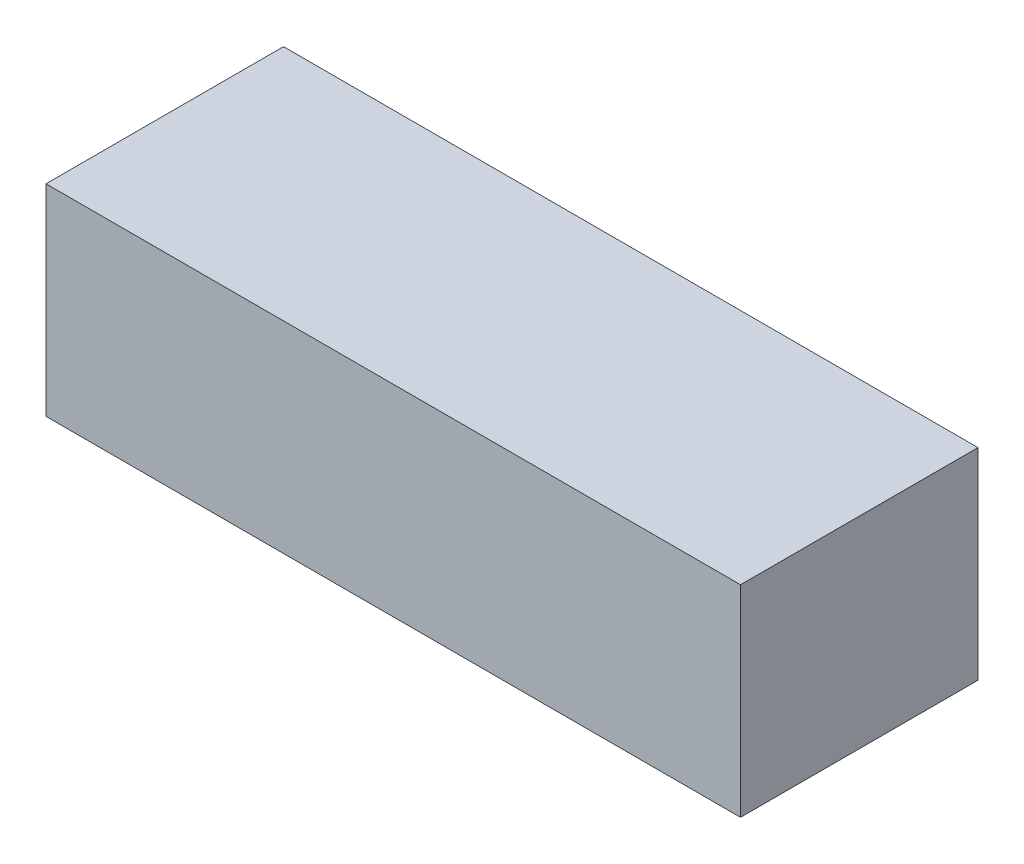
ISO-10303-21;
HEADER;
FILE_DESCRIPTION(('STEP AP214'),'2;1');
FILE_NAME('part.step','',(''),(''),'','','');
FILE_SCHEMA(('AUTOMOTIVE_DESIGN { 1 0 10303 214 1 1 1 1 }'));
ENDSEC;
DATA;
#1=APPLICATION_CONTEXT('core data for automotive mechanical design processes');
#2=APPLICATION_PROTOCOL_DEFINITION('international standard','automotive_design',2000,#1);
#3=PRODUCT_CONTEXT('',#1,'mechanical');
#4=PRODUCT('Part','Part','',(#3));
#5=PRODUCT_RELATED_PRODUCT_CATEGORY('part','',(#4));
#6=PRODUCT_DEFINITION_FORMATION('','',#4);
#7=PRODUCT_DEFINITION_CONTEXT('part definition',#1,'design');
#8=PRODUCT_DEFINITION('design','',#6,#7);
#9=PRODUCT_DEFINITION_SHAPE('','',#8);
#10=(LENGTH_UNIT() NAMED_UNIT(*) SI_UNIT(.MILLI.,.METRE.));
#11=(NAMED_UNIT(*) PLANE_ANGLE_UNIT() SI_UNIT($,.RADIAN.));
#12=(NAMED_UNIT(*) SI_UNIT($,.STERADIAN.) SOLID_ANGLE_UNIT());
#13=UNCERTAINTY_MEASURE_WITH_UNIT(LENGTH_MEASURE(1.E-05),#10,'distance_accuracy_value','');
#14=(GEOMETRIC_REPRESENTATION_CONTEXT(3) GLOBAL_UNCERTAINTY_ASSIGNED_CONTEXT((#13)) GLOBAL_UNIT_ASSIGNED_CONTEXT((#10,
#11,#12)) REPRESENTATION_CONTEXT('',''));
#15=CARTESIAN_POINT('',(0.,0.,0.));
#16=DIRECTION('',(0.,0.,1.));
#17=DIRECTION('',(1.,0.,0.));
#18=AXIS2_PLACEMENT_3D('',#15,#16,#17);
#19=CARTESIAN_POINT('',(32.75,19.,-11.2));
#20=DIRECTION('',(-1.,0.,0.));
#21=DIRECTION('',(0.,0.,1.));
#22=AXIS2_PLACEMENT_3D('',#19,#20,#21);
#23=PLANE('',#22);
#24=DIRECTION('',(0.,0.,-1.));
#25=VECTOR('',#24,1.);
#26=CARTESIAN_POINT('',(32.75,0.,-11.2));
#27=LINE('',#26,#25);
#28=CARTESIAN_POINT('',(32.75,0.,11.2));
#29=VERTEX_POINT('',#28);
#30=CARTESIAN_POINT('',(32.75,0.,-11.2));
#31=VERTEX_POINT('',#30);
#32=EDGE_CURVE('E98',#29,#31,#27,.T.);
#33=ORIENTED_EDGE('',*,*,#32,.T.);
#34=DIRECTION('',(0.,-1.,0.));
#35=VECTOR('',#34,1.);
#36=CARTESIAN_POINT('',(32.75,19.,-11.2));
#37=LINE('',#36,#35);
#38=CARTESIAN_POINT('',(32.75,19.,-11.2));
#39=VERTEX_POINT('',#38);
#40=EDGE_CURVE('E11',#39,#31,#37,.T.);
#41=ORIENTED_EDGE('',*,*,#40,.F.);
#42=DIRECTION('',(0.,0.,-1.));
#43=VECTOR('',#42,1.);
#44=CARTESIAN_POINT('',(32.75,19.,-11.2));
#45=LINE('',#44,#43);
#46=CARTESIAN_POINT('',(32.75,19.,11.2));
#47=VERTEX_POINT('',#46);
#48=EDGE_CURVE('E86',#47,#39,#45,.T.);
#49=ORIENTED_EDGE('',*,*,#48,.F.);
#50=DIRECTION('',(0.,-1.,0.));
#51=VECTOR('',#50,1.);
#52=CARTESIAN_POINT('',(32.75,19.,11.2));
#53=LINE('',#52,#51);
#54=EDGE_CURVE('E94',#47,#29,#53,.T.);
#55=ORIENTED_EDGE('',*,*,#54,.T.);
#56=EDGE_LOOP('',(#33,#41,#49,#55));
#57=FACE_BOUND('',#56,.T.);
#58=ADVANCED_FACE('F35',(#57),#23,.F.);
#59=CARTESIAN_POINT('',(-32.75,19.,-11.2));
#60=DIRECTION('',(0.,0.,1.));
#61=DIRECTION('',(1.,0.,0.));
#62=AXIS2_PLACEMENT_3D('',#59,#60,#61);
#63=PLANE('',#62);
#64=DIRECTION('',(-1.,0.,0.));
#65=VECTOR('',#64,1.);
#66=CARTESIAN_POINT('',(-32.75,0.,-11.2));
#67=LINE('',#66,#65);
#68=CARTESIAN_POINT('',(-32.75,0.,-11.2));
#69=VERTEX_POINT('',#68);
#70=EDGE_CURVE('E90',#31,#69,#67,.T.);
#71=ORIENTED_EDGE('',*,*,#70,.T.);
#72=DIRECTION('',(0.,-1.,0.));
#73=VECTOR('',#72,1.);
#74=CARTESIAN_POINT('',(-32.75,19.,-11.2));
#75=LINE('',#74,#73);
#76=CARTESIAN_POINT('',(-32.75,19.,-11.2));
#77=VERTEX_POINT('',#76);
#78=EDGE_CURVE('E43',#77,#69,#75,.T.);
#79=ORIENTED_EDGE('',*,*,#78,.F.);
#80=DIRECTION('',(-1.,0.,0.));
#81=VECTOR('',#80,1.);
#82=CARTESIAN_POINT('',(-32.75,19.,-11.2));
#83=LINE('',#82,#81);
#84=EDGE_CURVE('E81',#39,#77,#83,.T.);
#85=ORIENTED_EDGE('',*,*,#84,.F.);
#86=ORIENTED_EDGE('',*,*,#40,.T.);
#87=EDGE_LOOP('',(#71,#79,#85,#86));
#88=FACE_BOUND('',#87,.T.);
#89=ADVANCED_FACE('F89',(#88),#63,.F.);
#90=CARTESIAN_POINT('',(-32.75,19.,-11.2));
#91=DIRECTION('',(1.,0.,0.));
#92=DIRECTION('',(0.,0.,-1.));
#93=AXIS2_PLACEMENT_3D('',#90,#91,#92);
#94=PLANE('',#93);
#95=DIRECTION('',(0.,0.,1.));
#96=VECTOR('',#95,1.);
#97=CARTESIAN_POINT('',(-32.75,0.,-11.2));
#98=LINE('',#97,#96);
#99=CARTESIAN_POINT('',(-32.75,0.,11.2));
#100=VERTEX_POINT('',#99);
#101=EDGE_CURVE('E68',#69,#100,#98,.T.);
#102=ORIENTED_EDGE('',*,*,#101,.T.);
#103=DIRECTION('',(0.,-1.,0.));
#104=VECTOR('',#103,1.);
#105=CARTESIAN_POINT('',(-32.75,19.,11.2));
#106=LINE('',#105,#104);
#107=CARTESIAN_POINT('',(-32.75,19.,11.2));
#108=VERTEX_POINT('',#107);
#109=EDGE_CURVE('E91',#108,#100,#106,.T.);
#110=ORIENTED_EDGE('',*,*,#109,.F.);
#111=DIRECTION('',(0.,0.,1.));
#112=VECTOR('',#111,1.);
#113=CARTESIAN_POINT('',(-32.75,19.,-11.2));
#114=LINE('',#113,#112);
#115=EDGE_CURVE('E84',#77,#108,#114,.T.);
#116=ORIENTED_EDGE('',*,*,#115,.F.);
#117=ORIENTED_EDGE('',*,*,#78,.T.);
#118=EDGE_LOOP('',(#102,#110,#116,#117));
#119=FACE_BOUND('',#118,.T.);
#120=ADVANCED_FACE('F92',(#119),#94,.F.);
#121=CARTESIAN_POINT('',(-32.75,19.,11.2));
#122=DIRECTION('',(0.,0.,-1.));
#123=DIRECTION('',(-1.,0.,0.));
#124=AXIS2_PLACEMENT_3D('',#121,#122,#123);
#125=PLANE('',#124);
#126=DIRECTION('',(1.,0.,0.));
#127=VECTOR('',#126,1.);
#128=CARTESIAN_POINT('',(-32.75,0.,11.2));
#129=LINE('',#128,#127);
#130=EDGE_CURVE('E74',#100,#29,#129,.T.);
#131=ORIENTED_EDGE('',*,*,#130,.T.);
#132=ORIENTED_EDGE('',*,*,#54,.F.);
#133=DIRECTION('',(1.,0.,0.));
#134=VECTOR('',#133,1.);
#135=CARTESIAN_POINT('',(-32.75,19.,11.2));
#136=LINE('',#135,#134);
#137=EDGE_CURVE('E51',#108,#47,#136,.T.);
#138=ORIENTED_EDGE('',*,*,#137,.F.);
#139=ORIENTED_EDGE('',*,*,#109,.T.);
#140=EDGE_LOOP('',(#131,#132,#138,#139));
#141=FACE_BOUND('',#140,.T.);
#142=ADVANCED_FACE('F105',(#141),#125,.F.);
#143=CARTESIAN_POINT('',(0.,19.,0.));
#144=DIRECTION('',(0.,1.,0.));
#145=DIRECTION('',(0.,0.,1.));
#146=AXIS2_PLACEMENT_3D('',#143,#144,#145);
#147=PLANE('',#146);
#148=ORIENTED_EDGE('',*,*,#48,.T.);
#149=ORIENTED_EDGE('',*,*,#84,.T.);
#150=ORIENTED_EDGE('',*,*,#115,.T.);
#151=ORIENTED_EDGE('',*,*,#137,.T.);
#152=EDGE_LOOP('',(#148,#149,#150,#151));
#153=FACE_BOUND('',#152,.T.);
#154=ADVANCED_FACE('F82',(#153),#147,.T.);
#155=CARTESIAN_POINT('',(0.,0.,0.));
#156=DIRECTION('',(0.,1.,0.));
#157=DIRECTION('',(0.,0.,1.));
#158=AXIS2_PLACEMENT_3D('',#155,#156,#157);
#159=PLANE('',#158);
#160=ORIENTED_EDGE('',*,*,#32,.F.);
#161=ORIENTED_EDGE('',*,*,#130,.F.);
#162=ORIENTED_EDGE('',*,*,#101,.F.);
#163=ORIENTED_EDGE('',*,*,#70,.F.);
#164=EDGE_LOOP('',(#160,#161,#162,#163));
#165=FACE_BOUND('',#164,.T.);
#166=ADVANCED_FACE('F108',(#165),#159,.F.);
#167=CLOSED_SHELL('',(#58,#89,#120,#142,#154,#166));
#168=MANIFOLD_SOLID_BREP('B2',#167);
#169=ADVANCED_BREP_SHAPE_REPRESENTATION('',(#18,#168),#14);
#170=SHAPE_DEFINITION_REPRESENTATION(#9,#169);
ENDSEC;
END-ISO-10303-21;
